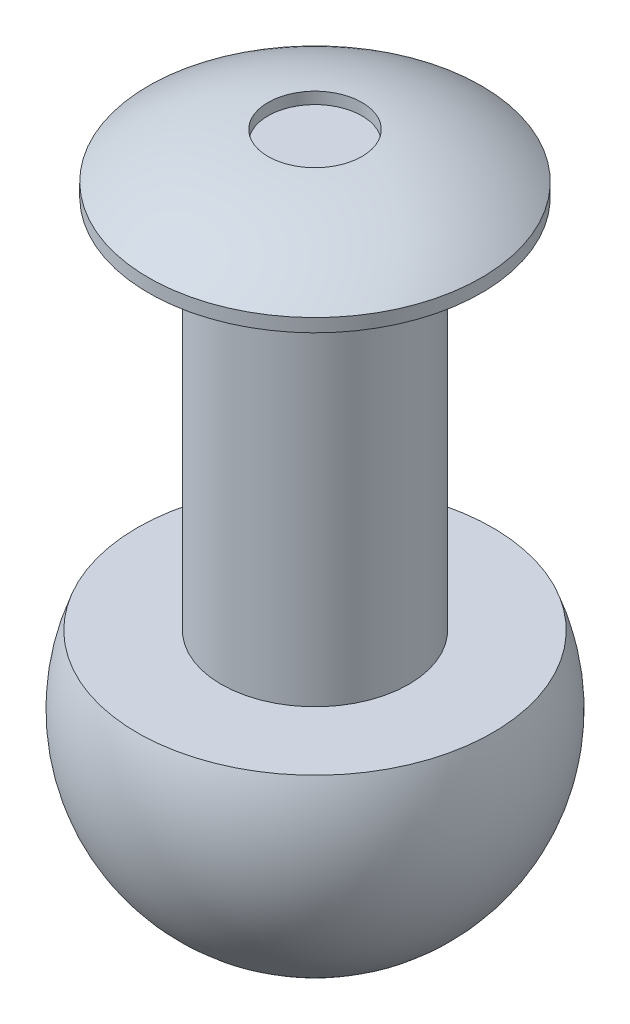
ISO-10303-21;
HEADER;
FILE_DESCRIPTION(('STEP AP214'),'2;1');
FILE_NAME('part.step','',(''),(''),'','','');
FILE_SCHEMA(('AUTOMOTIVE_DESIGN { 1 0 10303 214 1 1 1 1 }'));
ENDSEC;
DATA;
#1=APPLICATION_CONTEXT('core data for automotive mechanical design processes');
#2=APPLICATION_PROTOCOL_DEFINITION('international standard','automotive_design',2000,#1);
#3=PRODUCT_CONTEXT('',#1,'mechanical');
#4=PRODUCT('Part','Part','',(#3));
#5=PRODUCT_RELATED_PRODUCT_CATEGORY('part','',(#4));
#6=PRODUCT_DEFINITION_FORMATION('','',#4);
#7=PRODUCT_DEFINITION_CONTEXT('part definition',#1,'design');
#8=PRODUCT_DEFINITION('design','',#6,#7);
#9=PRODUCT_DEFINITION_SHAPE('','',#8);
#10=(LENGTH_UNIT() NAMED_UNIT(*) SI_UNIT(.MILLI.,.METRE.));
#11=(NAMED_UNIT(*) PLANE_ANGLE_UNIT() SI_UNIT($,.RADIAN.));
#12=(NAMED_UNIT(*) SI_UNIT($,.STERADIAN.) SOLID_ANGLE_UNIT());
#13=UNCERTAINTY_MEASURE_WITH_UNIT(LENGTH_MEASURE(1.E-05),#10,'distance_accuracy_value','');
#14=(GEOMETRIC_REPRESENTATION_CONTEXT(3) GLOBAL_UNCERTAINTY_ASSIGNED_CONTEXT((#13)) GLOBAL_UNIT_ASSIGNED_CONTEXT((#10,
#11,#12)) REPRESENTATION_CONTEXT('',''));
#15=CARTESIAN_POINT('',(0.,0.,0.));
#16=DIRECTION('',(0.,0.,1.));
#17=DIRECTION('',(1.,0.,0.));
#18=AXIS2_PLACEMENT_3D('',#15,#16,#17);
#19=CARTESIAN_POINT('',(0.,8.00000000000004,0.));
#20=DIRECTION('',(0.,-1.,0.));
#21=DIRECTION('',(0.,0.,-1.00000000000002));
#22=AXIS2_PLACEMENT_3D('',#19,#20,#21);
#23=CYLINDRICAL_SURFACE('',#22,2.);
#24=CARTESIAN_POINT('',(0.,8.00000000000004,0.));
#25=DIRECTION('',(0.,1.,0.));
#26=DIRECTION('',(0.,0.,1.00000000000002));
#27=AXIS2_PLACEMENT_3D('',#24,#25,#26);
#28=CIRCLE('',#27,2.);
#29=CARTESIAN_POINT('',(0.,8.00000000000004,2.00000000000003));
#30=VERTEX_POINT('',#29);
#31=EDGE_CURVE('E10',#30,#30,#28,.T.);
#32=ORIENTED_EDGE('',*,*,#31,.F.);
#33=EDGE_LOOP('',(#32));
#34=FACE_BOUND('',#33,.T.);
#35=CARTESIAN_POINT('',(0.,0.,0.));
#36=DIRECTION('',(0.,1.,0.));
#37=DIRECTION('',(-1.00000000000002,0.,0.));
#38=AXIS2_PLACEMENT_3D('',#35,#36,#37);
#39=CIRCLE('',#38,2.);
#40=CARTESIAN_POINT('',(-2.00000000000003,0.,0.));
#41=VERTEX_POINT('',#40);
#42=EDGE_CURVE('E46',#41,#41,#39,.T.);
#43=ORIENTED_EDGE('',*,*,#42,.T.);
#44=EDGE_LOOP('',(#43));
#45=FACE_BOUND('',#44,.T.);
#46=ADVANCED_FACE('F38',(#34,#45),#23,.T.);
#47=CARTESIAN_POINT('',(0.,0.,0.));
#48=DIRECTION('',(0.,1.,0.));
#49=DIRECTION('',(-1.00000000000002,0.,0.));
#50=AXIS2_PLACEMENT_3D('',#47,#48,#49);
#51=PLANE('',#50);
#52=ORIENTED_EDGE('',*,*,#42,.F.);
#53=EDGE_LOOP('',(#52));
#54=FACE_BOUND('',#53,.T.);
#55=CARTESIAN_POINT('',(0.,0.,0.));
#56=DIRECTION('',(0.,1.,0.));
#57=DIRECTION('',(-1.00000000000002,0.,0.));
#58=AXIS2_PLACEMENT_3D('',#55,#56,#57);
#59=CIRCLE('',#58,3.78822298954585);
#60=CARTESIAN_POINT('',(-3.78822298954591,0.,0.));
#61=VERTEX_POINT('',#60);
#62=EDGE_CURVE('E52',#61,#61,#59,.T.);
#63=ORIENTED_EDGE('',*,*,#62,.T.);
#64=EDGE_LOOP('',(#63));
#65=FACE_BOUND('',#64,.T.);
#66=ADVANCED_FACE('F102',(#54,#65),#51,.T.);
#67=CARTESIAN_POINT('',(0.,-1.45431535678497,0.));
#68=DIRECTION('',(0.,1.,0.));
#69=DIRECTION('',(-1.00000000000002,0.,0.));
#70=AXIS2_PLACEMENT_3D('',#67,#68,#69);
#71=SPHERICAL_SURFACE('',#70,4.05779084915725);
#72=ORIENTED_EDGE('',*,*,#62,.F.);
#73=EDGE_LOOP('',(#72));
#74=FACE_BOUND('',#73,.T.);
#75=ADVANCED_FACE('F84',(#74),#71,.T.);
#76=CARTESIAN_POINT('',(5.89805981832114E-13,4.34044835080051,0.));
#77=DIRECTION('',(0.,-1.,0.));
#78=DIRECTION('',(0.,0.,-1.00000000000002));
#79=AXIS2_PLACEMENT_3D('',#76,#77,#78);
#80=DEGENERATE_TOROIDAL_SURFACE('',#79,0.596176569034401,4.9236308422217,.T.);
#81=CARTESIAN_POINT('',(0.,9.2474909741207,0.));
#82=DIRECTION('',(0.,-1.,0.));
#83=DIRECTION('',(0.,0.,-1.00000000000002));
#84=AXIS2_PLACEMENT_3D('',#81,#82,#83);
#85=CIRCLE('',#84,1.);
#86=CARTESIAN_POINT('',(0.,9.2474909741207,-1.00000000000002));
#87=VERTEX_POINT('',#86);
#88=EDGE_CURVE('E41',#87,#87,#85,.F.);
#89=ORIENTED_EDGE('',*,*,#88,.F.);
#90=EDGE_LOOP('',(#89));
#91=FACE_BOUND('',#90,.T.);
#92=CARTESIAN_POINT('',(0.,8.28157152863355,0.));
#93=DIRECTION('',(0.,-1.,0.));
#94=DIRECTION('',(0.,0.,-1.00000000000002));
#95=AXIS2_PLACEMENT_3D('',#92,#93,#94);
#96=CIRCLE('',#95,3.54739475270414);
#97=CARTESIAN_POINT('',(0.,8.28157152863355,-3.5473947527042));
#98=VERTEX_POINT('',#97);
#99=EDGE_CURVE('E58',#98,#98,#96,.T.);
#100=ORIENTED_EDGE('',*,*,#99,.F.);
#101=EDGE_LOOP('',(#100));
#102=FACE_BOUND('',#101,.T.);
#103=ADVANCED_FACE('F80',(#91,#102),#80,.T.);
#104=CARTESIAN_POINT('',(0.,8.00000000000004,0.));
#105=DIRECTION('',(0.,-1.,0.));
#106=DIRECTION('',(0.,0.,-1.00000000000002));
#107=AXIS2_PLACEMENT_3D('',#104,#105,#106);
#108=CYLINDRICAL_SURFACE('',#107,3.54739475270414);
#109=ORIENTED_EDGE('',*,*,#99,.T.);
#110=EDGE_LOOP('',(#109));
#111=FACE_BOUND('',#110,.T.);
#112=CARTESIAN_POINT('',(0.,8.00000000000004,0.));
#113=DIRECTION('',(0.,-1.,0.));
#114=DIRECTION('',(0.,0.,-1.00000000000002));
#115=AXIS2_PLACEMENT_3D('',#112,#113,#114);
#116=CIRCLE('',#115,3.54739475270414);
#117=CARTESIAN_POINT('',(0.,8.00000000000004,-3.5473947527042));
#118=VERTEX_POINT('',#117);
#119=EDGE_CURVE('E62',#118,#118,#116,.T.);
#120=ORIENTED_EDGE('',*,*,#119,.F.);
#121=EDGE_LOOP('',(#120));
#122=FACE_BOUND('',#121,.T.);
#123=ADVANCED_FACE('F83',(#111,#122),#108,.T.);
#124=CARTESIAN_POINT('',(0.,8.00000000000004,0.));
#125=DIRECTION('',(0.,-1.,0.));
#126=DIRECTION('',(0.,0.,-1.00000000000002));
#127=AXIS2_PLACEMENT_3D('',#124,#125,#126);
#128=PLANE('',#127);
#129=ORIENTED_EDGE('',*,*,#31,.T.);
#130=EDGE_LOOP('',(#129));
#131=FACE_BOUND('',#130,.T.);
#132=ORIENTED_EDGE('',*,*,#119,.T.);
#133=EDGE_LOOP('',(#132));
#134=FACE_BOUND('',#133,.T.);
#135=ADVANCED_FACE('F90',(#131,#134),#128,.T.);
#136=CARTESIAN_POINT('',(0.,8.9999999999999,0.));
#137=DIRECTION('',(0.,1.,0.));
#138=DIRECTION('',(0.,0.,1.00000000000002));
#139=AXIS2_PLACEMENT_3D('',#136,#137,#138);
#140=CYLINDRICAL_SURFACE('',#139,1.);
#141=ORIENTED_EDGE('',*,*,#88,.T.);
#142=EDGE_LOOP('',(#141));
#143=FACE_BOUND('',#142,.T.);
#144=CARTESIAN_POINT('',(0.,8.9999999999999,0.));
#145=DIRECTION('',(0.,1.,0.));
#146=DIRECTION('',(0.,0.,1.00000000000002));
#147=AXIS2_PLACEMENT_3D('',#144,#145,#146);
#148=CIRCLE('',#147,1.);
#149=CARTESIAN_POINT('',(0.,8.9999999999999,1.00000000000002));
#150=VERTEX_POINT('',#149);
#151=EDGE_CURVE('E66',#150,#150,#148,.T.);
#152=ORIENTED_EDGE('',*,*,#151,.F.);
#153=EDGE_LOOP('',(#152));
#154=FACE_BOUND('',#153,.T.);
#155=ADVANCED_FACE('F77',(#143,#154),#140,.F.);
#156=CARTESIAN_POINT('',(0.,8.9999999999999,0.));
#157=DIRECTION('',(0.,1.,0.));
#158=DIRECTION('',(0.,0.,1.00000000000002));
#159=AXIS2_PLACEMENT_3D('',#156,#157,#158);
#160=PLANE('',#159);
#161=ORIENTED_EDGE('',*,*,#151,.T.);
#162=EDGE_LOOP('',(#161));
#163=FACE_BOUND('',#162,.T.);
#164=ADVANCED_FACE('F99',(#163),#160,.T.);
#165=CLOSED_SHELL('',(#46,#66,#75,#103,#123,#135,#155,#164));
#166=MANIFOLD_SOLID_BREP('B2',#165);
#167=ADVANCED_BREP_SHAPE_REPRESENTATION('',(#18,#166),#14);
#168=SHAPE_DEFINITION_REPRESENTATION(#9,#167);
ENDSEC;
END-ISO-10303-21;
